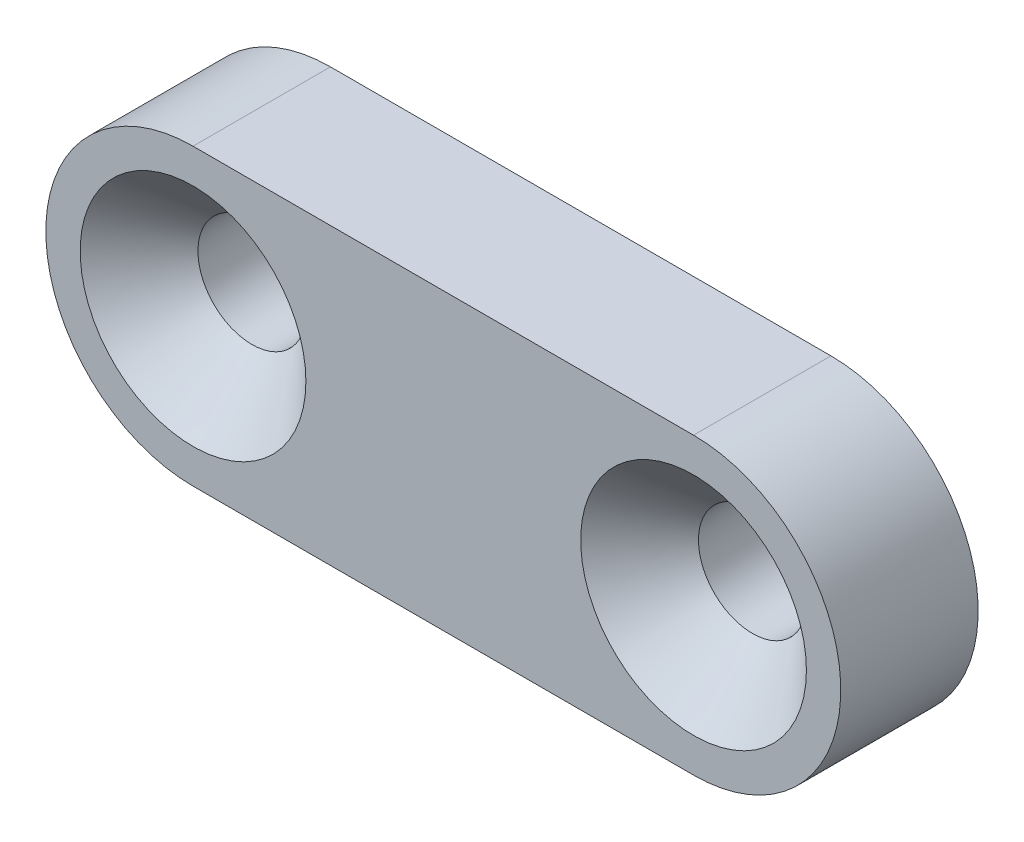
ISO-10303-21;
HEADER;
FILE_DESCRIPTION(('STEP AP214'),'2;1');
FILE_NAME('part.step','',(''),(''),'','','');
FILE_SCHEMA(('AUTOMOTIVE_DESIGN { 1 0 10303 214 1 1 1 1 }'));
ENDSEC;
DATA;
#1=APPLICATION_CONTEXT('core data for automotive mechanical design processes');
#2=APPLICATION_PROTOCOL_DEFINITION('international standard','automotive_design',2000,#1);
#3=PRODUCT_CONTEXT('',#1,'mechanical');
#4=PRODUCT('Part','Part','',(#3));
#5=PRODUCT_RELATED_PRODUCT_CATEGORY('part','',(#4));
#6=PRODUCT_DEFINITION_FORMATION('','',#4);
#7=PRODUCT_DEFINITION_CONTEXT('part definition',#1,'design');
#8=PRODUCT_DEFINITION('design','',#6,#7);
#9=PRODUCT_DEFINITION_SHAPE('','',#8);
#10=(LENGTH_UNIT() NAMED_UNIT(*) SI_UNIT(.MILLI.,.METRE.));
#11=(NAMED_UNIT(*) PLANE_ANGLE_UNIT() SI_UNIT($,.RADIAN.));
#12=(NAMED_UNIT(*) SI_UNIT($,.STERADIAN.) SOLID_ANGLE_UNIT());
#13=UNCERTAINTY_MEASURE_WITH_UNIT(LENGTH_MEASURE(1.E-05),#10,'distance_accuracy_value','');
#14=(GEOMETRIC_REPRESENTATION_CONTEXT(3) GLOBAL_UNCERTAINTY_ASSIGNED_CONTEXT((#13)) GLOBAL_UNIT_ASSIGNED_CONTEXT((#10,
#11,#12)) REPRESENTATION_CONTEXT('',''));
#15=CARTESIAN_POINT('',(0.,0.,0.));
#16=DIRECTION('',(0.,0.,1.));
#17=DIRECTION('',(1.,0.,0.));
#18=AXIS2_PLACEMENT_3D('',#15,#16,#17);
#19=CARTESIAN_POINT('',(0.,0.,7.));
#20=DIRECTION('',(0.,0.,1.));
#21=DIRECTION('',(1.,0.,0.));
#22=AXIS2_PLACEMENT_3D('',#19,#20,#21);
#23=PLANE('',#22);
#24=CARTESIAN_POINT('',(25.5,0.,7.));
#25=DIRECTION('',(0.,0.,1.));
#26=DIRECTION('',(1.,0.,0.));
#27=AXIS2_PLACEMENT_3D('',#24,#25,#26);
#28=CIRCLE('',#27,5.75000000000001);
#29=CARTESIAN_POINT('',(31.25,0.,7.));
#30=VERTEX_POINT('',#29);
#31=EDGE_CURVE('E52',#30,#30,#28,.F.);
#32=ORIENTED_EDGE('',*,*,#31,.T.);
#33=EDGE_LOOP('',(#32));
#34=FACE_BOUND('',#33,.T.);
#35=CARTESIAN_POINT('',(0.,0.,7.));
#36=DIRECTION('',(0.,0.,1.));
#37=DIRECTION('',(1.,0.,0.));
#38=AXIS2_PLACEMENT_3D('',#35,#36,#37);
#39=CIRCLE('',#38,5.75000000000001);
#40=CARTESIAN_POINT('',(5.75000000000001,0.,7.));
#41=VERTEX_POINT('',#40);
#42=EDGE_CURVE('E135',#41,#41,#39,.F.);
#43=ORIENTED_EDGE('',*,*,#42,.T.);
#44=EDGE_LOOP('',(#43));
#45=FACE_BOUND('',#44,.T.);
#46=CARTESIAN_POINT('',(0.,0.,7.));
#47=DIRECTION('',(0.,0.,1.));
#48=DIRECTION('',(1.,0.,0.));
#49=AXIS2_PLACEMENT_3D('',#46,#47,#48);
#50=CIRCLE('',#49,7.5);
#51=CARTESIAN_POINT('',(0.,7.5,7.));
#52=VERTEX_POINT('',#51);
#53=CARTESIAN_POINT('',(0.,-7.5,7.));
#54=VERTEX_POINT('',#53);
#55=EDGE_CURVE('E95',#52,#54,#50,.T.);
#56=ORIENTED_EDGE('',*,*,#55,.T.);
#57=DIRECTION('',(1.,0.,0.));
#58=VECTOR('',#57,1.);
#59=CARTESIAN_POINT('',(0.,-7.5,7.));
#60=LINE('',#59,#58);
#61=CARTESIAN_POINT('',(25.5,-7.5,7.));
#62=VERTEX_POINT('',#61);
#63=EDGE_CURVE('E91',#54,#62,#60,.T.);
#64=ORIENTED_EDGE('',*,*,#63,.T.);
#65=CARTESIAN_POINT('',(25.5,0.,7.));
#66=DIRECTION('',(0.,0.,1.));
#67=DIRECTION('',(-1.,0.,0.));
#68=AXIS2_PLACEMENT_3D('',#65,#66,#67);
#69=CIRCLE('',#68,7.5);
#70=CARTESIAN_POINT('',(25.5,7.5,7.));
#71=VERTEX_POINT('',#70);
#72=EDGE_CURVE('E93',#62,#71,#69,.T.);
#73=ORIENTED_EDGE('',*,*,#72,.T.);
#74=DIRECTION('',(-1.,0.,0.));
#75=VECTOR('',#74,1.);
#76=CARTESIAN_POINT('',(0.,7.5,7.));
#77=LINE('',#76,#75);
#78=EDGE_CURVE('E60',#71,#52,#77,.T.);
#79=ORIENTED_EDGE('',*,*,#78,.T.);
#80=EDGE_LOOP('',(#56,#64,#73,#79));
#81=FACE_BOUND('',#80,.T.);
#82=ADVANCED_FACE('F41',(#34,#45,#81),#23,.T.);
#83=CARTESIAN_POINT('',(0.,0.,0.));
#84=DIRECTION('',(0.,0.,1.));
#85=DIRECTION('',(1.,0.,0.));
#86=AXIS2_PLACEMENT_3D('',#83,#84,#85);
#87=PLANE('',#86);
#88=CARTESIAN_POINT('',(0.,0.,0.));
#89=DIRECTION('',(0.,0.,1.));
#90=DIRECTION('',(1.,0.,0.));
#91=AXIS2_PLACEMENT_3D('',#88,#89,#90);
#92=CIRCLE('',#91,7.5);
#93=CARTESIAN_POINT('',(0.,7.5,0.));
#94=VERTEX_POINT('',#93);
#95=CARTESIAN_POINT('',(0.,-7.5,0.));
#96=VERTEX_POINT('',#95);
#97=EDGE_CURVE('E114',#94,#96,#92,.T.);
#98=ORIENTED_EDGE('',*,*,#97,.F.);
#99=DIRECTION('',(-1.,0.,0.));
#100=VECTOR('',#99,1.);
#101=CARTESIAN_POINT('',(0.,7.5,0.));
#102=LINE('',#101,#100);
#103=CARTESIAN_POINT('',(25.5,7.5,0.));
#104=VERTEX_POINT('',#103);
#105=EDGE_CURVE('E83',#104,#94,#102,.T.);
#106=ORIENTED_EDGE('',*,*,#105,.F.);
#107=CARTESIAN_POINT('',(25.5,0.,0.));
#108=DIRECTION('',(0.,0.,1.));
#109=DIRECTION('',(-1.,0.,0.));
#110=AXIS2_PLACEMENT_3D('',#107,#108,#109);
#111=CIRCLE('',#110,7.5);
#112=CARTESIAN_POINT('',(25.5,-7.5,0.));
#113=VERTEX_POINT('',#112);
#114=EDGE_CURVE('E77',#113,#104,#111,.T.);
#115=ORIENTED_EDGE('',*,*,#114,.F.);
#116=DIRECTION('',(1.,0.,0.));
#117=VECTOR('',#116,1.);
#118=CARTESIAN_POINT('',(0.,-7.5,0.));
#119=LINE('',#118,#117);
#120=EDGE_CURVE('E101',#96,#113,#119,.T.);
#121=ORIENTED_EDGE('',*,*,#120,.F.);
#122=EDGE_LOOP('',(#98,#106,#115,#121));
#123=FACE_BOUND('',#122,.T.);
#124=CARTESIAN_POINT('',(0.,0.,0.));
#125=DIRECTION('',(0.,0.,1.));
#126=DIRECTION('',(1.,0.,0.));
#127=AXIS2_PLACEMENT_3D('',#124,#125,#126);
#128=CIRCLE('',#127,2.75);
#129=CARTESIAN_POINT('',(2.75,0.,0.));
#130=VERTEX_POINT('',#129);
#131=EDGE_CURVE('E118',#130,#130,#128,.T.);
#132=ORIENTED_EDGE('',*,*,#131,.T.);
#133=EDGE_LOOP('',(#132));
#134=FACE_BOUND('',#133,.T.);
#135=CARTESIAN_POINT('',(25.5,0.,0.));
#136=DIRECTION('',(0.,0.,1.));
#137=DIRECTION('',(1.,0.,0.));
#138=AXIS2_PLACEMENT_3D('',#135,#136,#137);
#139=CIRCLE('',#138,2.75);
#140=CARTESIAN_POINT('',(28.25,0.,0.));
#141=VERTEX_POINT('',#140);
#142=EDGE_CURVE('E156',#141,#141,#139,.T.);
#143=ORIENTED_EDGE('',*,*,#142,.T.);
#144=EDGE_LOOP('',(#143));
#145=FACE_BOUND('',#144,.T.);
#146=ADVANCED_FACE('F166',(#123,#134,#145),#87,.F.);
#147=CARTESIAN_POINT('',(0.,0.,7.));
#148=DIRECTION('',(0.,0.,-1.));
#149=DIRECTION('',(-1.,0.,0.));
#150=AXIS2_PLACEMENT_3D('',#147,#148,#149);
#151=CYLINDRICAL_SURFACE('',#150,7.5);
#152=ORIENTED_EDGE('',*,*,#97,.T.);
#153=DIRECTION('',(0.,0.,-1.));
#154=VECTOR('',#153,1.);
#155=CARTESIAN_POINT('',(0.,-7.5,7.));
#156=LINE('',#155,#154);
#157=EDGE_CURVE('E103',#54,#96,#156,.T.);
#158=ORIENTED_EDGE('',*,*,#157,.F.);
#159=ORIENTED_EDGE('',*,*,#55,.F.);
#160=DIRECTION('',(0.,0.,-1.));
#161=VECTOR('',#160,1.);
#162=CARTESIAN_POINT('',(0.,7.5,7.));
#163=LINE('',#162,#161);
#164=EDGE_CURVE('E110',#52,#94,#163,.T.);
#165=ORIENTED_EDGE('',*,*,#164,.T.);
#166=EDGE_LOOP('',(#152,#158,#159,#165));
#167=FACE_BOUND('',#166,.T.);
#168=ADVANCED_FACE('F181',(#167),#151,.T.);
#169=CARTESIAN_POINT('',(0.,-7.5,7.));
#170=DIRECTION('',(0.,1.,0.));
#171=DIRECTION('',(0.,0.,1.));
#172=AXIS2_PLACEMENT_3D('',#169,#170,#171);
#173=PLANE('',#172);
#174=ORIENTED_EDGE('',*,*,#120,.T.);
#175=DIRECTION('',(0.,0.,-1.));
#176=VECTOR('',#175,1.);
#177=CARTESIAN_POINT('',(25.5,-7.5,7.));
#178=LINE('',#177,#176);
#179=EDGE_CURVE('E99',#62,#113,#178,.T.);
#180=ORIENTED_EDGE('',*,*,#179,.F.);
#181=ORIENTED_EDGE('',*,*,#63,.F.);
#182=ORIENTED_EDGE('',*,*,#157,.T.);
#183=EDGE_LOOP('',(#174,#180,#181,#182));
#184=FACE_BOUND('',#183,.T.);
#185=ADVANCED_FACE('F100',(#184),#173,.F.);
#186=CARTESIAN_POINT('',(25.5,0.,7.));
#187=DIRECTION('',(0.,0.,-1.));
#188=DIRECTION('',(-1.,0.,0.));
#189=AXIS2_PLACEMENT_3D('',#186,#187,#188);
#190=CYLINDRICAL_SURFACE('',#189,7.5);
#191=ORIENTED_EDGE('',*,*,#114,.T.);
#192=DIRECTION('',(0.,0.,-1.));
#193=VECTOR('',#192,1.);
#194=CARTESIAN_POINT('',(25.5,7.5,7.));
#195=LINE('',#194,#193);
#196=EDGE_CURVE('E104',#71,#104,#195,.T.);
#197=ORIENTED_EDGE('',*,*,#196,.F.);
#198=ORIENTED_EDGE('',*,*,#72,.F.);
#199=ORIENTED_EDGE('',*,*,#179,.T.);
#200=EDGE_LOOP('',(#191,#197,#198,#199));
#201=FACE_BOUND('',#200,.T.);
#202=ADVANCED_FACE('F106',(#201),#190,.T.);
#203=CARTESIAN_POINT('',(0.,7.5,7.));
#204=DIRECTION('',(0.,-1.,0.));
#205=DIRECTION('',(0.,0.,-1.));
#206=AXIS2_PLACEMENT_3D('',#203,#204,#205);
#207=PLANE('',#206);
#208=ORIENTED_EDGE('',*,*,#105,.T.);
#209=ORIENTED_EDGE('',*,*,#164,.F.);
#210=ORIENTED_EDGE('',*,*,#78,.F.);
#211=ORIENTED_EDGE('',*,*,#196,.T.);
#212=EDGE_LOOP('',(#208,#209,#210,#211));
#213=FACE_BOUND('',#212,.T.);
#214=ADVANCED_FACE('F169',(#213),#207,.F.);
#215=CARTESIAN_POINT('',(0.,0.,7.));
#216=DIRECTION('',(0.,0.,-1.));
#217=DIRECTION('',(-1.,0.,0.));
#218=AXIS2_PLACEMENT_3D('',#215,#216,#217);
#219=CYLINDRICAL_SURFACE('',#218,2.75);
#220=CARTESIAN_POINT('',(0.,0.,4.));
#221=DIRECTION('',(0.,0.,1.));
#222=DIRECTION('',(1.,0.,0.));
#223=AXIS2_PLACEMENT_3D('',#220,#221,#222);
#224=CIRCLE('',#223,2.75);
#225=CARTESIAN_POINT('',(2.75,0.,4.));
#226=VERTEX_POINT('',#225);
#227=EDGE_CURVE('E11',#226,#226,#224,.T.);
#228=ORIENTED_EDGE('',*,*,#227,.T.);
#229=EDGE_LOOP('',(#228));
#230=FACE_BOUND('',#229,.T.);
#231=ORIENTED_EDGE('',*,*,#131,.F.);
#232=EDGE_LOOP('',(#231));
#233=FACE_BOUND('',#232,.T.);
#234=ADVANCED_FACE('F152',(#230,#233),#219,.F.);
#235=CARTESIAN_POINT('',(25.5,0.,7.));
#236=DIRECTION('',(0.,0.,-1.));
#237=DIRECTION('',(-1.,0.,0.));
#238=AXIS2_PLACEMENT_3D('',#235,#236,#237);
#239=CYLINDRICAL_SURFACE('',#238,2.75);
#240=CARTESIAN_POINT('',(25.5,0.,4.));
#241=DIRECTION('',(0.,0.,1.));
#242=DIRECTION('',(1.,0.,0.));
#243=AXIS2_PLACEMENT_3D('',#240,#241,#242);
#244=CIRCLE('',#243,2.75);
#245=CARTESIAN_POINT('',(28.25,0.,4.));
#246=VERTEX_POINT('',#245);
#247=EDGE_CURVE('E131',#246,#246,#244,.T.);
#248=ORIENTED_EDGE('',*,*,#247,.T.);
#249=EDGE_LOOP('',(#248));
#250=FACE_BOUND('',#249,.T.);
#251=ORIENTED_EDGE('',*,*,#142,.F.);
#252=EDGE_LOOP('',(#251));
#253=FACE_BOUND('',#252,.T.);
#254=ADVANCED_FACE('F147',(#250,#253),#239,.F.);
#255=CARTESIAN_POINT('',(25.5,0.,4.));
#256=DIRECTION('',(0.,0.,1.));
#257=DIRECTION('',(1.,0.,0.));
#258=AXIS2_PLACEMENT_3D('',#255,#256,#257);
#259=CONICAL_SURFACE('',#258,2.75,0.78539816339745);
#260=ORIENTED_EDGE('',*,*,#31,.F.);
#261=EDGE_LOOP('',(#260));
#262=FACE_BOUND('',#261,.T.);
#263=ORIENTED_EDGE('',*,*,#247,.F.);
#264=EDGE_LOOP('',(#263));
#265=FACE_BOUND('',#264,.T.);
#266=ADVANCED_FACE('F144',(#262,#265),#259,.F.);
#267=CARTESIAN_POINT('',(0.,0.,4.));
#268=DIRECTION('',(0.,0.,1.));
#269=DIRECTION('',(1.,0.,0.));
#270=AXIS2_PLACEMENT_3D('',#267,#268,#269);
#271=CONICAL_SURFACE('',#270,2.75,0.78539816339745);
#272=ORIENTED_EDGE('',*,*,#42,.F.);
#273=EDGE_LOOP('',(#272));
#274=FACE_BOUND('',#273,.T.);
#275=ORIENTED_EDGE('',*,*,#227,.F.);
#276=EDGE_LOOP('',(#275));
#277=FACE_BOUND('',#276,.T.);
#278=ADVANCED_FACE('F44',(#274,#277),#271,.F.);
#279=CLOSED_SHELL('',(#82,#146,#168,#185,#202,#214,#234,#254,#266,#278));
#280=MANIFOLD_SOLID_BREP('B2',#279);
#281=ADVANCED_BREP_SHAPE_REPRESENTATION('',(#18,#280),#14);
#282=SHAPE_DEFINITION_REPRESENTATION(#9,#281);
ENDSEC;
END-ISO-10303-21;
